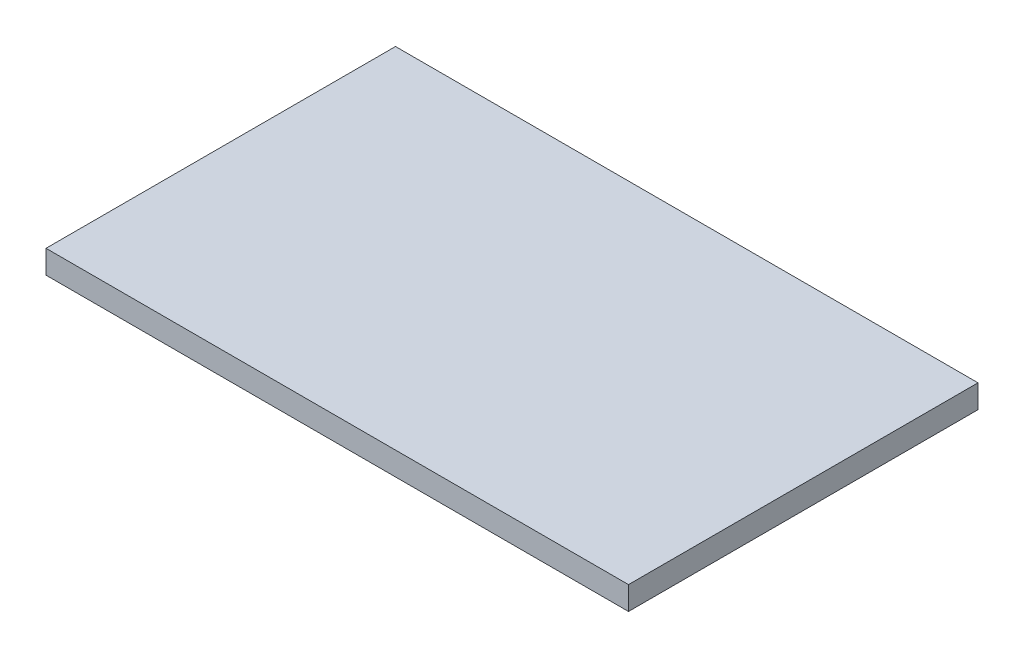
ISO-10303-21;
HEADER;
FILE_DESCRIPTION(('STEP AP214'),'2;1');
FILE_NAME('part.step','',(''),(''),'','','');
FILE_SCHEMA(('AUTOMOTIVE_DESIGN { 1 0 10303 214 1 1 1 1 }'));
ENDSEC;
DATA;
#1=APPLICATION_CONTEXT('core data for automotive mechanical design processes');
#2=APPLICATION_PROTOCOL_DEFINITION('international standard','automotive_design',2000,#1);
#3=PRODUCT_CONTEXT('',#1,'mechanical');
#4=PRODUCT('Part','Part','',(#3));
#5=PRODUCT_RELATED_PRODUCT_CATEGORY('part','',(#4));
#6=PRODUCT_DEFINITION_FORMATION('','',#4);
#7=PRODUCT_DEFINITION_CONTEXT('part definition',#1,'design');
#8=PRODUCT_DEFINITION('design','',#6,#7);
#9=PRODUCT_DEFINITION_SHAPE('','',#8);
#10=(LENGTH_UNIT() NAMED_UNIT(*) SI_UNIT(.MILLI.,.METRE.));
#11=(NAMED_UNIT(*) PLANE_ANGLE_UNIT() SI_UNIT($,.RADIAN.));
#12=(NAMED_UNIT(*) SI_UNIT($,.STERADIAN.) SOLID_ANGLE_UNIT());
#13=UNCERTAINTY_MEASURE_WITH_UNIT(LENGTH_MEASURE(1.E-05),#10,'distance_accuracy_value','');
#14=(GEOMETRIC_REPRESENTATION_CONTEXT(3) GLOBAL_UNCERTAINTY_ASSIGNED_CONTEXT((#13)) GLOBAL_UNIT_ASSIGNED_CONTEXT((#10,
#11,#12)) REPRESENTATION_CONTEXT('',''));
#15=CARTESIAN_POINT('',(0.,0.,0.));
#16=DIRECTION('',(0.,0.,1.));
#17=DIRECTION('',(1.,0.,0.));
#18=AXIS2_PLACEMENT_3D('',#15,#16,#17);
#19=CARTESIAN_POINT('',(100.,4.,60.));
#20=DIRECTION('',(-1.,0.,0.));
#21=DIRECTION('',(0.,0.,1.));
#22=AXIS2_PLACEMENT_3D('',#19,#20,#21);
#23=PLANE('',#22);
#24=DIRECTION('',(0.,0.,-1.));
#25=VECTOR('',#24,1.);
#26=CARTESIAN_POINT('',(100.,-4.,60.));
#27=LINE('',#26,#25);
#28=CARTESIAN_POINT('',(100.,-4.,60.));
#29=VERTEX_POINT('',#28);
#30=CARTESIAN_POINT('',(100.,-4.,-60.));
#31=VERTEX_POINT('',#30);
#32=EDGE_CURVE('E100',#29,#31,#27,.T.);
#33=ORIENTED_EDGE('',*,*,#32,.T.);
#34=DIRECTION('',(0.,-1.,0.));
#35=VECTOR('',#34,1.);
#36=CARTESIAN_POINT('',(100.,4.,-60.));
#37=LINE('',#36,#35);
#38=CARTESIAN_POINT('',(100.,4.,-60.));
#39=VERTEX_POINT('',#38);
#40=EDGE_CURVE('E11',#39,#31,#37,.T.);
#41=ORIENTED_EDGE('',*,*,#40,.F.);
#42=DIRECTION('',(0.,0.,-1.));
#43=VECTOR('',#42,1.);
#44=CARTESIAN_POINT('',(100.,4.,60.));
#45=LINE('',#44,#43);
#46=CARTESIAN_POINT('',(100.,4.,60.));
#47=VERTEX_POINT('',#46);
#48=EDGE_CURVE('E88',#47,#39,#45,.T.);
#49=ORIENTED_EDGE('',*,*,#48,.F.);
#50=DIRECTION('',(0.,-1.,0.));
#51=VECTOR('',#50,1.);
#52=CARTESIAN_POINT('',(100.,4.,60.));
#53=LINE('',#52,#51);
#54=EDGE_CURVE('E96',#47,#29,#53,.T.);
#55=ORIENTED_EDGE('',*,*,#54,.T.);
#56=EDGE_LOOP('',(#33,#41,#49,#55));
#57=FACE_BOUND('',#56,.T.);
#58=ADVANCED_FACE('F37',(#57),#23,.F.);
#59=CARTESIAN_POINT('',(-100.,4.,-60.));
#60=DIRECTION('',(0.,0.,1.));
#61=DIRECTION('',(1.,0.,0.));
#62=AXIS2_PLACEMENT_3D('',#59,#60,#61);
#63=PLANE('',#62);
#64=DIRECTION('',(-1.,0.,0.));
#65=VECTOR('',#64,1.);
#66=CARTESIAN_POINT('',(-100.,-4.,-60.));
#67=LINE('',#66,#65);
#68=CARTESIAN_POINT('',(-100.,-4.,-60.));
#69=VERTEX_POINT('',#68);
#70=EDGE_CURVE('E92',#31,#69,#67,.T.);
#71=ORIENTED_EDGE('',*,*,#70,.T.);
#72=DIRECTION('',(0.,-1.,0.));
#73=VECTOR('',#72,1.);
#74=CARTESIAN_POINT('',(-100.,4.,-60.));
#75=LINE('',#74,#73);
#76=CARTESIAN_POINT('',(-100.,4.,-60.));
#77=VERTEX_POINT('',#76);
#78=EDGE_CURVE('E45',#77,#69,#75,.T.);
#79=ORIENTED_EDGE('',*,*,#78,.F.);
#80=DIRECTION('',(-1.,0.,0.));
#81=VECTOR('',#80,1.);
#82=CARTESIAN_POINT('',(-100.,4.,-60.));
#83=LINE('',#82,#81);
#84=EDGE_CURVE('E83',#39,#77,#83,.T.);
#85=ORIENTED_EDGE('',*,*,#84,.F.);
#86=ORIENTED_EDGE('',*,*,#40,.T.);
#87=EDGE_LOOP('',(#71,#79,#85,#86));
#88=FACE_BOUND('',#87,.T.);
#89=ADVANCED_FACE('F91',(#88),#63,.F.);
#90=CARTESIAN_POINT('',(-100.,4.,60.));
#91=DIRECTION('',(1.,0.,0.));
#92=DIRECTION('',(0.,0.,-1.));
#93=AXIS2_PLACEMENT_3D('',#90,#91,#92);
#94=PLANE('',#93);
#95=DIRECTION('',(0.,0.,1.));
#96=VECTOR('',#95,1.);
#97=CARTESIAN_POINT('',(-100.,-4.,60.));
#98=LINE('',#97,#96);
#99=CARTESIAN_POINT('',(-100.,-4.,60.));
#100=VERTEX_POINT('',#99);
#101=EDGE_CURVE('E70',#69,#100,#98,.T.);
#102=ORIENTED_EDGE('',*,*,#101,.T.);
#103=DIRECTION('',(0.,-1.,0.));
#104=VECTOR('',#103,1.);
#105=CARTESIAN_POINT('',(-100.,4.,60.));
#106=LINE('',#105,#104);
#107=CARTESIAN_POINT('',(-100.,4.,60.));
#108=VERTEX_POINT('',#107);
#109=EDGE_CURVE('E93',#108,#100,#106,.T.);
#110=ORIENTED_EDGE('',*,*,#109,.F.);
#111=DIRECTION('',(0.,0.,1.));
#112=VECTOR('',#111,1.);
#113=CARTESIAN_POINT('',(-100.,4.,60.));
#114=LINE('',#113,#112);
#115=EDGE_CURVE('E86',#77,#108,#114,.T.);
#116=ORIENTED_EDGE('',*,*,#115,.F.);
#117=ORIENTED_EDGE('',*,*,#78,.T.);
#118=EDGE_LOOP('',(#102,#110,#116,#117));
#119=FACE_BOUND('',#118,.T.);
#120=ADVANCED_FACE('F94',(#119),#94,.F.);
#121=CARTESIAN_POINT('',(-100.,4.,60.));
#122=DIRECTION('',(0.,0.,-1.));
#123=DIRECTION('',(-1.,0.,0.));
#124=AXIS2_PLACEMENT_3D('',#121,#122,#123);
#125=PLANE('',#124);
#126=DIRECTION('',(1.,0.,0.));
#127=VECTOR('',#126,1.);
#128=CARTESIAN_POINT('',(-100.,-4.,60.));
#129=LINE('',#128,#127);
#130=EDGE_CURVE('E76',#100,#29,#129,.T.);
#131=ORIENTED_EDGE('',*,*,#130,.T.);
#132=ORIENTED_EDGE('',*,*,#54,.F.);
#133=DIRECTION('',(1.,0.,0.));
#134=VECTOR('',#133,1.);
#135=CARTESIAN_POINT('',(-100.,4.,60.));
#136=LINE('',#135,#134);
#137=EDGE_CURVE('E53',#108,#47,#136,.T.);
#138=ORIENTED_EDGE('',*,*,#137,.F.);
#139=ORIENTED_EDGE('',*,*,#109,.T.);
#140=EDGE_LOOP('',(#131,#132,#138,#139));
#141=FACE_BOUND('',#140,.T.);
#142=ADVANCED_FACE('F107',(#141),#125,.F.);
#143=CARTESIAN_POINT('',(0.,4.,0.));
#144=DIRECTION('',(0.,-1.,0.));
#145=DIRECTION('',(0.,0.,-1.));
#146=AXIS2_PLACEMENT_3D('',#143,#144,#145);
#147=PLANE('',#146);
#148=ORIENTED_EDGE('',*,*,#48,.T.);
#149=ORIENTED_EDGE('',*,*,#84,.T.);
#150=ORIENTED_EDGE('',*,*,#115,.T.);
#151=ORIENTED_EDGE('',*,*,#137,.T.);
#152=EDGE_LOOP('',(#148,#149,#150,#151));
#153=FACE_BOUND('',#152,.T.);
#154=ADVANCED_FACE('F84',(#153),#147,.F.);
#155=CARTESIAN_POINT('',(0.,-4.,0.));
#156=DIRECTION('',(0.,-1.,0.));
#157=DIRECTION('',(0.,0.,-1.));
#158=AXIS2_PLACEMENT_3D('',#155,#156,#157);
#159=PLANE('',#158);
#160=ORIENTED_EDGE('',*,*,#32,.F.);
#161=ORIENTED_EDGE('',*,*,#130,.F.);
#162=ORIENTED_EDGE('',*,*,#101,.F.);
#163=ORIENTED_EDGE('',*,*,#70,.F.);
#164=EDGE_LOOP('',(#160,#161,#162,#163));
#165=FACE_BOUND('',#164,.T.);
#166=ADVANCED_FACE('F110',(#165),#159,.T.);
#167=CLOSED_SHELL('',(#58,#89,#120,#142,#154,#166));
#168=MANIFOLD_SOLID_BREP('B2',#167);
#169=ADVANCED_BREP_SHAPE_REPRESENTATION('',(#18,#168),#14);
#170=SHAPE_DEFINITION_REPRESENTATION(#9,#169);
ENDSEC;
END-ISO-10303-21;
